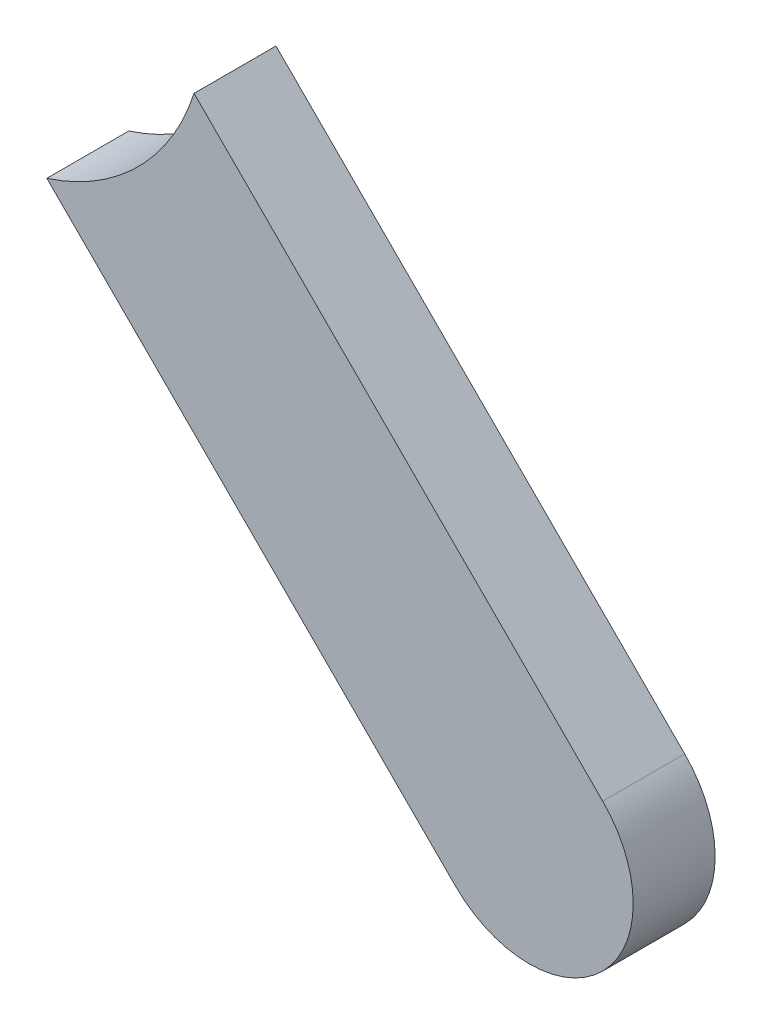
ISO-10303-21;
HEADER;
FILE_DESCRIPTION(('STEP AP214'),'2;1');
FILE_NAME('part.step','',(''),(''),'','','');
FILE_SCHEMA(('AUTOMOTIVE_DESIGN { 1 0 10303 214 1 1 1 1 }'));
ENDSEC;
DATA;
#1=APPLICATION_CONTEXT('core data for automotive mechanical design processes');
#2=APPLICATION_PROTOCOL_DEFINITION('international standard','automotive_design',2000,#1);
#3=PRODUCT_CONTEXT('',#1,'mechanical');
#4=PRODUCT('Part','Part','',(#3));
#5=PRODUCT_RELATED_PRODUCT_CATEGORY('part','',(#4));
#6=PRODUCT_DEFINITION_FORMATION('','',#4);
#7=PRODUCT_DEFINITION_CONTEXT('part definition',#1,'design');
#8=PRODUCT_DEFINITION('design','',#6,#7);
#9=PRODUCT_DEFINITION_SHAPE('','',#8);
#10=(LENGTH_UNIT() NAMED_UNIT(*) SI_UNIT(.MILLI.,.METRE.));
#11=(NAMED_UNIT(*) PLANE_ANGLE_UNIT() SI_UNIT($,.RADIAN.));
#12=(NAMED_UNIT(*) SI_UNIT($,.STERADIAN.) SOLID_ANGLE_UNIT());
#13=UNCERTAINTY_MEASURE_WITH_UNIT(LENGTH_MEASURE(1.E-05),#10,'distance_accuracy_value','');
#14=(GEOMETRIC_REPRESENTATION_CONTEXT(3) GLOBAL_UNCERTAINTY_ASSIGNED_CONTEXT((#13)) GLOBAL_UNIT_ASSIGNED_CONTEXT((#10,
#11,#12)) REPRESENTATION_CONTEXT('',''));
#15=CARTESIAN_POINT('',(0.,0.,0.));
#16=DIRECTION('',(0.,0.,1.));
#17=DIRECTION('',(1.,0.,0.));
#18=AXIS2_PLACEMENT_3D('',#15,#16,#17);
#19=CARTESIAN_POINT('',(149.140329064847,85.3204643951531,0.));
#20=DIRECTION('',(0.707106781186544,0.707106781186551,0.));
#21=DIRECTION('',(0.707106781186551,-0.707106781186544,0.));
#22=AXIS2_PLACEMENT_3D('',#19,#20,#21);
#23=PLANE('',#22);
#24=DIRECTION('',(0.707106781186551,-0.707106781186544,0.));
#25=VECTOR('',#24,1.);
#26=CARTESIAN_POINT('',(148.79139406,85.6693994,0.1999996));
#27=LINE('',#26,#25);
#28=CARTESIAN_POINT('',(149.140329064847,85.3204643951531,0.1999996));
#29=VERTEX_POINT('',#28);
#30=CARTESIAN_POINT('',(150.1375966,84.32319686,0.1999996));
#31=VERTEX_POINT('',#30);
#32=EDGE_CURVE('E11',#29,#31,#27,.T.);
#33=ORIENTED_EDGE('',*,*,#32,.F.);
#34=DIRECTION('',(0.,0.,1.));
#35=VECTOR('',#34,1.);
#36=CARTESIAN_POINT('',(149.140329064847,85.3204643951531,0.));
#37=LINE('',#36,#35);
#38=CARTESIAN_POINT('',(149.140329064847,85.3204643951531,0.));
#39=VERTEX_POINT('',#38);
#40=EDGE_CURVE('E24',#39,#29,#37,.T.);
#41=ORIENTED_EDGE('',*,*,#40,.F.);
#42=DIRECTION('',(0.707106781186551,-0.707106781186544,0.));
#43=VECTOR('',#42,1.);
#44=CARTESIAN_POINT('',(148.79139406,85.6693994,0.));
#45=LINE('',#44,#43);
#46=CARTESIAN_POINT('',(150.1375966,84.32319686,0.));
#47=VERTEX_POINT('',#46);
#48=EDGE_CURVE('E75',#39,#47,#45,.T.);
#49=ORIENTED_EDGE('',*,*,#48,.T.);
#50=DIRECTION('',(0.,0.,1.));
#51=VECTOR('',#50,1.);
#52=CARTESIAN_POINT('',(150.1375966,84.32319686,0.));
#53=LINE('',#52,#51);
#54=EDGE_CURVE('E37',#47,#31,#53,.T.);
#55=ORIENTED_EDGE('',*,*,#54,.T.);
#56=EDGE_LOOP('',(#33,#41,#49,#55));
#57=FACE_BOUND('',#56,.T.);
#58=ADVANCED_FACE('F17',(#57),#23,.F.);
#59=CARTESIAN_POINT('',(150.31720127,84.50280153,0.));
#60=DIRECTION('',(0.,0.,-1.));
#61=DIRECTION('',(-0.707106781186548,-0.707106781186548,0.));
#62=AXIS2_PLACEMENT_3D('',#59,#60,#61);
#63=CYLINDRICAL_SURFACE('',#62,0.253999360179546);
#64=CARTESIAN_POINT('',(150.31720127,84.50280153,0.1999996));
#65=DIRECTION('',(0.,0.,1.));
#66=DIRECTION('',(-0.707106781186548,-0.707106781186548,0.));
#67=AXIS2_PLACEMENT_3D('',#64,#65,#66);
#68=CIRCLE('',#67,0.253999360179546);
#69=CARTESIAN_POINT('',(150.49680594,84.6824062,0.1999996));
#70=VERTEX_POINT('',#69);
#71=EDGE_CURVE('E83',#31,#70,#68,.T.);
#72=ORIENTED_EDGE('',*,*,#71,.F.);
#73=ORIENTED_EDGE('',*,*,#54,.F.);
#74=CARTESIAN_POINT('',(150.31720127,84.50280153,0.));
#75=DIRECTION('',(0.,0.,1.));
#76=DIRECTION('',(-0.707106781186548,-0.707106781186548,0.));
#77=AXIS2_PLACEMENT_3D('',#74,#75,#76);
#78=CIRCLE('',#77,0.253999360179546);
#79=CARTESIAN_POINT('',(150.49680594,84.6824062,0.));
#80=VERTEX_POINT('',#79);
#81=EDGE_CURVE('E81',#47,#80,#78,.T.);
#82=ORIENTED_EDGE('',*,*,#81,.T.);
#83=DIRECTION('',(0.,0.,1.));
#84=VECTOR('',#83,1.);
#85=CARTESIAN_POINT('',(150.49680594,84.6824062,0.));
#86=LINE('',#85,#84);
#87=EDGE_CURVE('E67',#80,#70,#86,.T.);
#88=ORIENTED_EDGE('',*,*,#87,.T.);
#89=EDGE_LOOP('',(#72,#73,#82,#88));
#90=FACE_BOUND('',#89,.T.);
#91=ADVANCED_FACE('F89',(#90),#63,.T.);
#92=CARTESIAN_POINT('',(150.49680594,84.6824062,0.));
#93=DIRECTION('',(-0.707106781186548,-0.707106781186548,0.));
#94=DIRECTION('',(-0.707106781186548,0.707106781186548,0.));
#95=AXIS2_PLACEMENT_3D('',#92,#93,#94);
#96=PLANE('',#95);
#97=DIRECTION('',(-0.707106781186548,0.707106781186548,0.));
#98=VECTOR('',#97,1.);
#99=CARTESIAN_POINT('',(150.49680594,84.6824062,0.1999996));
#100=LINE('',#99,#98);
#101=CARTESIAN_POINT('',(149.499538404847,85.6796737351531,0.1999996));
#102=VERTEX_POINT('',#101);
#103=EDGE_CURVE('E71',#70,#102,#100,.T.);
#104=ORIENTED_EDGE('',*,*,#103,.F.);
#105=ORIENTED_EDGE('',*,*,#87,.F.);
#106=DIRECTION('',(-0.707106781186548,0.707106781186548,0.));
#107=VECTOR('',#106,1.);
#108=CARTESIAN_POINT('',(150.49680594,84.6824062,0.));
#109=LINE('',#108,#107);
#110=CARTESIAN_POINT('',(149.499538404847,85.6796737351531,0.));
#111=VERTEX_POINT('',#110);
#112=EDGE_CURVE('E63',#80,#111,#109,.T.);
#113=ORIENTED_EDGE('',*,*,#112,.T.);
#114=DIRECTION('',(0.,0.,1.));
#115=VECTOR('',#114,1.);
#116=CARTESIAN_POINT('',(149.499538404847,85.6796737351531,0.));
#117=LINE('',#116,#115);
#118=EDGE_CURVE('E53',#111,#102,#117,.T.);
#119=ORIENTED_EDGE('',*,*,#118,.T.);
#120=EDGE_LOOP('',(#104,#105,#113,#119));
#121=FACE_BOUND('',#120,.T.);
#122=ADVANCED_FACE('F66',(#121),#96,.F.);
#123=CARTESIAN_POINT('',(148.971,85.8490028,0.));
#124=DIRECTION('',(0.,0.,-1.));
#125=DIRECTION('',(1.,0.,0.));
#126=AXIS2_PLACEMENT_3D('',#123,#124,#125);
#127=CYLINDRICAL_SURFACE('',#126,0.55500016);
#128=ORIENTED_EDGE('',*,*,#40,.T.);
#129=CARTESIAN_POINT('',(148.971,85.8490028,0.1999996));
#130=DIRECTION('',(0.,0.,1.));
#131=DIRECTION('',(1.,0.,0.));
#132=AXIS2_PLACEMENT_3D('',#129,#130,#131);
#133=CIRCLE('',#132,0.55500016);
#134=EDGE_CURVE('E59',#29,#102,#133,.T.);
#135=ORIENTED_EDGE('',*,*,#134,.T.);
#136=ORIENTED_EDGE('',*,*,#118,.F.);
#137=CARTESIAN_POINT('',(148.971,85.8490028,0.));
#138=DIRECTION('',(0.,0.,1.));
#139=DIRECTION('',(1.,0.,0.));
#140=AXIS2_PLACEMENT_3D('',#137,#138,#139);
#141=CIRCLE('',#140,0.55500016);
#142=EDGE_CURVE('E57',#39,#111,#141,.T.);
#143=ORIENTED_EDGE('',*,*,#142,.F.);
#144=EDGE_LOOP('',(#128,#135,#136,#143));
#145=FACE_BOUND('',#144,.T.);
#146=ADVANCED_FACE('F55',(#145),#127,.F.);
#147=CARTESIAN_POINT('',(148.79139406,85.6693994,0.));
#148=DIRECTION('',(0.,0.,-1.));
#149=DIRECTION('',(-1.,0.,0.));
#150=AXIS2_PLACEMENT_3D('',#147,#148,#149);
#151=PLANE('',#150);
#152=ORIENTED_EDGE('',*,*,#48,.F.);
#153=ORIENTED_EDGE('',*,*,#142,.T.);
#154=ORIENTED_EDGE('',*,*,#112,.F.);
#155=ORIENTED_EDGE('',*,*,#81,.F.);
#156=EDGE_LOOP('',(#152,#153,#154,#155));
#157=FACE_BOUND('',#156,.T.);
#158=ADVANCED_FACE('F74',(#157),#151,.T.);
#159=CARTESIAN_POINT('',(148.79139406,85.6693994,0.1999996));
#160=DIRECTION('',(0.,0.,-1.));
#161=DIRECTION('',(-1.,0.,0.));
#162=AXIS2_PLACEMENT_3D('',#159,#160,#161);
#163=PLANE('',#162);
#164=ORIENTED_EDGE('',*,*,#134,.F.);
#165=ORIENTED_EDGE('',*,*,#32,.T.);
#166=ORIENTED_EDGE('',*,*,#71,.T.);
#167=ORIENTED_EDGE('',*,*,#103,.T.);
#168=EDGE_LOOP('',(#164,#165,#166,#167));
#169=FACE_BOUND('',#168,.T.);
#170=ADVANCED_FACE('F91',(#169),#163,.F.);
#171=CLOSED_SHELL('',(#58,#91,#122,#146,#158,#170));
#172=MANIFOLD_SOLID_BREP('B1',#171);
#173=ADVANCED_BREP_SHAPE_REPRESENTATION('',(#18,#172),#14);
#174=SHAPE_DEFINITION_REPRESENTATION(#9,#173);
ENDSEC;
END-ISO-10303-21;
